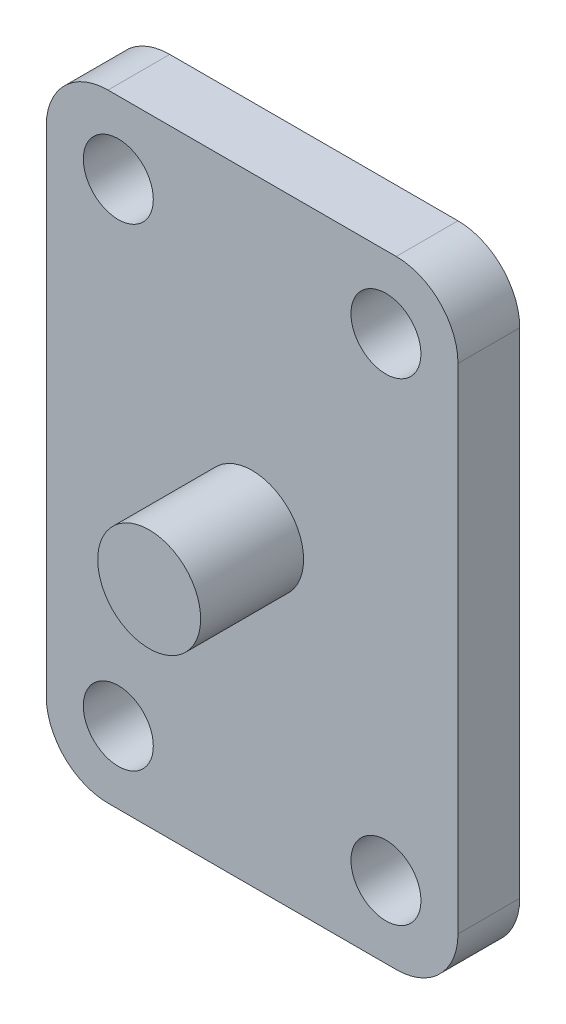
ISO-10303-21;
HEADER;
FILE_DESCRIPTION(('STEP AP214'),'2;1');
FILE_NAME('part.step','',(''),(''),'','','');
FILE_SCHEMA(('AUTOMOTIVE_DESIGN { 1 0 10303 214 1 1 1 1 }'));
ENDSEC;
DATA;
#1=APPLICATION_CONTEXT('core data for automotive mechanical design processes');
#2=APPLICATION_PROTOCOL_DEFINITION('international standard','automotive_design',2000,#1);
#3=PRODUCT_CONTEXT('',#1,'mechanical');
#4=PRODUCT('Part','Part','',(#3));
#5=PRODUCT_RELATED_PRODUCT_CATEGORY('part','',(#4));
#6=PRODUCT_DEFINITION_FORMATION('','',#4);
#7=PRODUCT_DEFINITION_CONTEXT('part definition',#1,'design');
#8=PRODUCT_DEFINITION('design','',#6,#7);
#9=PRODUCT_DEFINITION_SHAPE('','',#8);
#10=(LENGTH_UNIT() NAMED_UNIT(*) SI_UNIT(.MILLI.,.METRE.));
#11=(NAMED_UNIT(*) PLANE_ANGLE_UNIT() SI_UNIT($,.RADIAN.));
#12=(NAMED_UNIT(*) SI_UNIT($,.STERADIAN.) SOLID_ANGLE_UNIT());
#13=UNCERTAINTY_MEASURE_WITH_UNIT(LENGTH_MEASURE(1.E-05),#10,'distance_accuracy_value','');
#14=(GEOMETRIC_REPRESENTATION_CONTEXT(3) GLOBAL_UNCERTAINTY_ASSIGNED_CONTEXT((#13)) GLOBAL_UNIT_ASSIGNED_CONTEXT((#10,
#11,#12)) REPRESENTATION_CONTEXT('',''));
#15=CARTESIAN_POINT('',(0.,0.,0.));
#16=DIRECTION('',(0.,0.,1.));
#17=DIRECTION('',(1.,0.,0.));
#18=AXIS2_PLACEMENT_3D('',#15,#16,#17);
#19=CARTESIAN_POINT('',(0.,0.,3.));
#20=DIRECTION('',(0.,0.,-1.));
#21=DIRECTION('',(-1.,0.,0.));
#22=AXIS2_PLACEMENT_3D('',#19,#20,#21);
#23=PLANE('',#22);
#24=CARTESIAN_POINT('',(-6.5,-11.5,3.));
#25=DIRECTION('',(0.,0.,1.));
#26=DIRECTION('',(1.,0.,0.));
#27=AXIS2_PLACEMENT_3D('',#24,#25,#26);
#28=CIRCLE('',#27,1.7);
#29=CARTESIAN_POINT('',(-4.8,-11.5,3.));
#30=VERTEX_POINT('',#29);
#31=EDGE_CURVE('E171',#30,#30,#28,.T.);
#32=ORIENTED_EDGE('',*,*,#31,.F.);
#33=EDGE_LOOP('',(#32));
#34=FACE_BOUND('',#33,.T.);
#35=DIRECTION('',(0.,-1.,0.));
#36=VECTOR('',#35,1.);
#37=CARTESIAN_POINT('',(-10.,-15.,3.));
#38=LINE('',#37,#36);
#39=CARTESIAN_POINT('',(-10.,12.,3.));
#40=VERTEX_POINT('',#39);
#41=CARTESIAN_POINT('',(-10.,-12.,3.));
#42=VERTEX_POINT('',#41);
#43=EDGE_CURVE('E175',#40,#42,#38,.T.);
#44=ORIENTED_EDGE('',*,*,#43,.T.);
#45=CARTESIAN_POINT('',(-7.,-12.,3.));
#46=DIRECTION('',(0.,0.,-1.));
#47=DIRECTION('',(-1.,0.,0.));
#48=AXIS2_PLACEMENT_3D('',#45,#46,#47);
#49=CIRCLE('',#48,3.);
#50=CARTESIAN_POINT('',(-7.,-15.,3.));
#51=VERTEX_POINT('',#50);
#52=EDGE_CURVE('E151',#42,#51,#49,.F.);
#53=ORIENTED_EDGE('',*,*,#52,.T.);
#54=DIRECTION('',(1.,0.,0.));
#55=VECTOR('',#54,1.);
#56=CARTESIAN_POINT('',(-10.,-15.,3.));
#57=LINE('',#56,#55);
#58=CARTESIAN_POINT('',(7.,-15.,3.));
#59=VERTEX_POINT('',#58);
#60=EDGE_CURVE('E122',#51,#59,#57,.T.);
#61=ORIENTED_EDGE('',*,*,#60,.T.);
#62=CARTESIAN_POINT('',(7.,-12.,3.));
#63=DIRECTION('',(0.,0.,-1.));
#64=DIRECTION('',(-1.,0.,0.));
#65=AXIS2_PLACEMENT_3D('',#62,#63,#64);
#66=CIRCLE('',#65,3.);
#67=CARTESIAN_POINT('',(10.,-12.,3.));
#68=VERTEX_POINT('',#67);
#69=EDGE_CURVE('E149',#59,#68,#66,.F.);
#70=ORIENTED_EDGE('',*,*,#69,.T.);
#71=DIRECTION('',(0.,1.,0.));
#72=VECTOR('',#71,1.);
#73=CARTESIAN_POINT('',(10.,-15.,3.));
#74=LINE('',#73,#72);
#75=CARTESIAN_POINT('',(10.,12.,3.));
#76=VERTEX_POINT('',#75);
#77=EDGE_CURVE('E129',#68,#76,#74,.T.);
#78=ORIENTED_EDGE('',*,*,#77,.T.);
#79=CARTESIAN_POINT('',(7.,12.,3.));
#80=DIRECTION('',(0.,0.,-1.));
#81=DIRECTION('',(-1.,0.,0.));
#82=AXIS2_PLACEMENT_3D('',#79,#80,#81);
#83=CIRCLE('',#82,3.);
#84=CARTESIAN_POINT('',(7.,15.,3.));
#85=VERTEX_POINT('',#84);
#86=EDGE_CURVE('E57',#76,#85,#83,.F.);
#87=ORIENTED_EDGE('',*,*,#86,.T.);
#88=DIRECTION('',(-1.,0.,0.));
#89=VECTOR('',#88,1.);
#90=CARTESIAN_POINT('',(-10.,15.,3.));
#91=LINE('',#90,#89);
#92=CARTESIAN_POINT('',(-7.,15.,3.));
#93=VERTEX_POINT('',#92);
#94=EDGE_CURVE('E132',#85,#93,#91,.T.);
#95=ORIENTED_EDGE('',*,*,#94,.T.);
#96=CARTESIAN_POINT('',(-7.,12.,3.));
#97=DIRECTION('',(0.,0.,-1.));
#98=DIRECTION('',(-1.,0.,0.));
#99=AXIS2_PLACEMENT_3D('',#96,#97,#98);
#100=CIRCLE('',#99,3.);
#101=EDGE_CURVE('E146',#93,#40,#100,.F.);
#102=ORIENTED_EDGE('',*,*,#101,.T.);
#103=EDGE_LOOP('',(#44,#53,#61,#70,#78,#87,#95,#102));
#104=FACE_BOUND('',#103,.T.);
#105=CARTESIAN_POINT('',(6.5,-11.5,3.));
#106=DIRECTION('',(0.,0.,1.));
#107=DIRECTION('',(1.,0.,0.));
#108=AXIS2_PLACEMENT_3D('',#105,#106,#107);
#109=CIRCLE('',#108,1.7);
#110=CARTESIAN_POINT('',(8.2,-11.5,3.));
#111=VERTEX_POINT('',#110);
#112=EDGE_CURVE('E184',#111,#111,#109,.T.);
#113=ORIENTED_EDGE('',*,*,#112,.F.);
#114=EDGE_LOOP('',(#113));
#115=FACE_BOUND('',#114,.T.);
#116=CARTESIAN_POINT('',(6.5,11.5,3.));
#117=DIRECTION('',(0.,0.,1.));
#118=DIRECTION('',(1.,0.,0.));
#119=AXIS2_PLACEMENT_3D('',#116,#117,#118);
#120=CIRCLE('',#119,1.7);
#121=CARTESIAN_POINT('',(8.2,11.5,3.));
#122=VERTEX_POINT('',#121);
#123=EDGE_CURVE('E190',#122,#122,#120,.T.);
#124=ORIENTED_EDGE('',*,*,#123,.F.);
#125=EDGE_LOOP('',(#124));
#126=FACE_BOUND('',#125,.T.);
#127=CARTESIAN_POINT('',(-6.5,11.5,3.));
#128=DIRECTION('',(0.,0.,1.));
#129=DIRECTION('',(1.,0.,0.));
#130=AXIS2_PLACEMENT_3D('',#127,#128,#129);
#131=CIRCLE('',#130,1.7);
#132=CARTESIAN_POINT('',(-4.8,11.5,3.));
#133=VERTEX_POINT('',#132);
#134=EDGE_CURVE('E196',#133,#133,#131,.T.);
#135=ORIENTED_EDGE('',*,*,#134,.F.);
#136=EDGE_LOOP('',(#135));
#137=FACE_BOUND('',#136,.T.);
#138=CARTESIAN_POINT('',(0.,0.,3.));
#139=DIRECTION('',(0.,0.,1.));
#140=DIRECTION('',(1.,0.,0.));
#141=AXIS2_PLACEMENT_3D('',#138,#139,#140);
#142=CIRCLE('',#141,2.5);
#143=CARTESIAN_POINT('',(2.5,0.,3.));
#144=VERTEX_POINT('',#143);
#145=EDGE_CURVE('E199',#144,#144,#142,.T.);
#146=ORIENTED_EDGE('',*,*,#145,.F.);
#147=EDGE_LOOP('',(#146));
#148=FACE_BOUND('',#147,.T.);
#149=ADVANCED_FACE('F35',(#34,#104,#115,#126,#137,#148),#23,.F.);
#150=CARTESIAN_POINT('',(0.,0.,0.));
#151=DIRECTION('',(0.,0.,-1.));
#152=DIRECTION('',(-1.,0.,0.));
#153=AXIS2_PLACEMENT_3D('',#150,#151,#152);
#154=PLANE('',#153);
#155=CARTESIAN_POINT('',(-6.5,11.5,0.));
#156=DIRECTION('',(0.,0.,1.));
#157=DIRECTION('',(1.,0.,0.));
#158=AXIS2_PLACEMENT_3D('',#155,#156,#157);
#159=CIRCLE('',#158,1.7);
#160=CARTESIAN_POINT('',(-4.8,11.5,0.));
#161=VERTEX_POINT('',#160);
#162=EDGE_CURVE('E193',#161,#161,#159,.T.);
#163=ORIENTED_EDGE('',*,*,#162,.T.);
#164=EDGE_LOOP('',(#163));
#165=FACE_BOUND('',#164,.T.);
#166=CARTESIAN_POINT('',(6.5,11.5,0.));
#167=DIRECTION('',(0.,0.,1.));
#168=DIRECTION('',(1.,0.,0.));
#169=AXIS2_PLACEMENT_3D('',#166,#167,#168);
#170=CIRCLE('',#169,1.7);
#171=CARTESIAN_POINT('',(8.2,11.5,0.));
#172=VERTEX_POINT('',#171);
#173=EDGE_CURVE('E187',#172,#172,#170,.T.);
#174=ORIENTED_EDGE('',*,*,#173,.T.);
#175=EDGE_LOOP('',(#174));
#176=FACE_BOUND('',#175,.T.);
#177=CARTESIAN_POINT('',(6.5,-11.5,0.));
#178=DIRECTION('',(0.,0.,1.));
#179=DIRECTION('',(1.,0.,0.));
#180=AXIS2_PLACEMENT_3D('',#177,#178,#179);
#181=CIRCLE('',#180,1.7);
#182=CARTESIAN_POINT('',(8.2,-11.5,0.));
#183=VERTEX_POINT('',#182);
#184=EDGE_CURVE('E181',#183,#183,#181,.T.);
#185=ORIENTED_EDGE('',*,*,#184,.T.);
#186=EDGE_LOOP('',(#185));
#187=FACE_BOUND('',#186,.T.);
#188=DIRECTION('',(1.,0.,0.));
#189=VECTOR('',#188,1.);
#190=CARTESIAN_POINT('',(-10.,-15.,0.));
#191=LINE('',#190,#189);
#192=CARTESIAN_POINT('',(-7.,-15.,0.));
#193=VERTEX_POINT('',#192);
#194=CARTESIAN_POINT('',(7.,-15.,0.));
#195=VERTEX_POINT('',#194);
#196=EDGE_CURVE('E119',#193,#195,#191,.T.);
#197=ORIENTED_EDGE('',*,*,#196,.F.);
#198=CARTESIAN_POINT('',(-7.,-12.,0.));
#199=DIRECTION('',(0.,0.,-1.));
#200=DIRECTION('',(-1.,0.,0.));
#201=AXIS2_PLACEMENT_3D('',#198,#199,#200);
#202=CIRCLE('',#201,3.);
#203=CARTESIAN_POINT('',(-10.,-12.,0.));
#204=VERTEX_POINT('',#203);
#205=EDGE_CURVE('E102',#193,#204,#202,.T.);
#206=ORIENTED_EDGE('',*,*,#205,.T.);
#207=DIRECTION('',(0.,-1.,0.));
#208=VECTOR('',#207,1.);
#209=CARTESIAN_POINT('',(-10.,-15.,0.));
#210=LINE('',#209,#208);
#211=CARTESIAN_POINT('',(-10.,12.,0.));
#212=VERTEX_POINT('',#211);
#213=EDGE_CURVE('E130',#212,#204,#210,.T.);
#214=ORIENTED_EDGE('',*,*,#213,.F.);
#215=CARTESIAN_POINT('',(-7.,12.,0.));
#216=DIRECTION('',(0.,0.,-1.));
#217=DIRECTION('',(-1.,0.,0.));
#218=AXIS2_PLACEMENT_3D('',#215,#216,#217);
#219=CIRCLE('',#218,3.);
#220=CARTESIAN_POINT('',(-7.,15.,0.));
#221=VERTEX_POINT('',#220);
#222=EDGE_CURVE('E123',#212,#221,#219,.T.);
#223=ORIENTED_EDGE('',*,*,#222,.T.);
#224=DIRECTION('',(-1.,0.,0.));
#225=VECTOR('',#224,1.);
#226=CARTESIAN_POINT('',(-10.,15.,0.));
#227=LINE('',#226,#225);
#228=CARTESIAN_POINT('',(7.,15.,0.));
#229=VERTEX_POINT('',#228);
#230=EDGE_CURVE('E134',#229,#221,#227,.T.);
#231=ORIENTED_EDGE('',*,*,#230,.F.);
#232=CARTESIAN_POINT('',(7.,12.,0.));
#233=DIRECTION('',(0.,0.,-1.));
#234=DIRECTION('',(-1.,0.,0.));
#235=AXIS2_PLACEMENT_3D('',#232,#233,#234);
#236=CIRCLE('',#235,3.);
#237=CARTESIAN_POINT('',(10.,12.,0.));
#238=VERTEX_POINT('',#237);
#239=EDGE_CURVE('E140',#229,#238,#236,.T.);
#240=ORIENTED_EDGE('',*,*,#239,.T.);
#241=DIRECTION('',(0.,1.,0.));
#242=VECTOR('',#241,1.);
#243=CARTESIAN_POINT('',(10.,-15.,0.));
#244=LINE('',#243,#242);
#245=CARTESIAN_POINT('',(10.,-12.,0.));
#246=VERTEX_POINT('',#245);
#247=EDGE_CURVE('E163',#246,#238,#244,.T.);
#248=ORIENTED_EDGE('',*,*,#247,.F.);
#249=CARTESIAN_POINT('',(7.,-12.,0.));
#250=DIRECTION('',(0.,0.,-1.));
#251=DIRECTION('',(-1.,0.,0.));
#252=AXIS2_PLACEMENT_3D('',#249,#250,#251);
#253=CIRCLE('',#252,3.);
#254=EDGE_CURVE('E113',#246,#195,#253,.T.);
#255=ORIENTED_EDGE('',*,*,#254,.T.);
#256=EDGE_LOOP('',(#197,#206,#214,#223,#231,#240,#248,#255));
#257=FACE_BOUND('',#256,.T.);
#258=CARTESIAN_POINT('',(-6.5,-11.5,0.));
#259=DIRECTION('',(0.,0.,1.));
#260=DIRECTION('',(1.,0.,0.));
#261=AXIS2_PLACEMENT_3D('',#258,#259,#260);
#262=CIRCLE('',#261,1.7);
#263=CARTESIAN_POINT('',(-4.8,-11.5,0.));
#264=VERTEX_POINT('',#263);
#265=EDGE_CURVE('E168',#264,#264,#262,.T.);
#266=ORIENTED_EDGE('',*,*,#265,.T.);
#267=EDGE_LOOP('',(#266));
#268=FACE_BOUND('',#267,.T.);
#269=CARTESIAN_POINT('',(0.,0.,0.));
#270=DIRECTION('',(0.,0.,-1.));
#271=DIRECTION('',(-1.,0.,0.));
#272=AXIS2_PLACEMENT_3D('',#269,#270,#271);
#273=CIRCLE('',#272,2.75);
#274=CARTESIAN_POINT('',(-2.75,0.,0.));
#275=VERTEX_POINT('',#274);
#276=EDGE_CURVE('E205',#275,#275,#273,.T.);
#277=ORIENTED_EDGE('',*,*,#276,.F.);
#278=EDGE_LOOP('',(#277));
#279=FACE_BOUND('',#278,.T.);
#280=ADVANCED_FACE('F126',(#165,#176,#187,#257,#268,#279),#154,.T.);
#281=CARTESIAN_POINT('',(10.,-15.,3.));
#282=DIRECTION('',(-1.,0.,0.));
#283=DIRECTION('',(0.,0.,1.));
#284=AXIS2_PLACEMENT_3D('',#281,#282,#283);
#285=PLANE('',#284);
#286=ORIENTED_EDGE('',*,*,#77,.F.);
#287=DIRECTION('',(0.,0.,-1.));
#288=VECTOR('',#287,1.);
#289=CARTESIAN_POINT('',(10.,-12.,3.));
#290=LINE('',#289,#288);
#291=EDGE_CURVE('E155',#68,#246,#290,.T.);
#292=ORIENTED_EDGE('',*,*,#291,.T.);
#293=ORIENTED_EDGE('',*,*,#247,.T.);
#294=DIRECTION('',(0.,0.,-1.));
#295=VECTOR('',#294,1.);
#296=CARTESIAN_POINT('',(10.,12.,3.));
#297=LINE('',#296,#295);
#298=EDGE_CURVE('E153',#238,#76,#297,.F.);
#299=ORIENTED_EDGE('',*,*,#298,.T.);
#300=EDGE_LOOP('',(#286,#292,#293,#299));
#301=FACE_BOUND('',#300,.T.);
#302=ADVANCED_FACE('F162',(#301),#285,.F.);
#303=CARTESIAN_POINT('',(-10.,15.,3.));
#304=DIRECTION('',(0.,-1.,0.));
#305=DIRECTION('',(0.,0.,-1.));
#306=AXIS2_PLACEMENT_3D('',#303,#304,#305);
#307=PLANE('',#306);
#308=ORIENTED_EDGE('',*,*,#94,.F.);
#309=DIRECTION('',(0.,0.,-1.));
#310=VECTOR('',#309,1.);
#311=CARTESIAN_POINT('',(7.,15.,3.));
#312=LINE('',#311,#310);
#313=EDGE_CURVE('E12',#85,#229,#312,.T.);
#314=ORIENTED_EDGE('',*,*,#313,.T.);
#315=ORIENTED_EDGE('',*,*,#230,.T.);
#316=DIRECTION('',(0.,0.,-1.));
#317=VECTOR('',#316,1.);
#318=CARTESIAN_POINT('',(-7.,15.,3.));
#319=LINE('',#318,#317);
#320=EDGE_CURVE('E44',#221,#93,#319,.F.);
#321=ORIENTED_EDGE('',*,*,#320,.T.);
#322=EDGE_LOOP('',(#308,#314,#315,#321));
#323=FACE_BOUND('',#322,.T.);
#324=ADVANCED_FACE('F218',(#323),#307,.F.);
#325=CARTESIAN_POINT('',(-10.,-15.,3.));
#326=DIRECTION('',(1.,0.,0.));
#327=DIRECTION('',(0.,0.,-1.));
#328=AXIS2_PLACEMENT_3D('',#325,#326,#327);
#329=PLANE('',#328);
#330=ORIENTED_EDGE('',*,*,#213,.T.);
#331=DIRECTION('',(0.,0.,-1.));
#332=VECTOR('',#331,1.);
#333=CARTESIAN_POINT('',(-10.,-12.,3.));
#334=LINE('',#333,#332);
#335=EDGE_CURVE('E107',#204,#42,#334,.F.);
#336=ORIENTED_EDGE('',*,*,#335,.T.);
#337=ORIENTED_EDGE('',*,*,#43,.F.);
#338=DIRECTION('',(0.,0.,-1.));
#339=VECTOR('',#338,1.);
#340=CARTESIAN_POINT('',(-10.,12.,3.));
#341=LINE('',#340,#339);
#342=EDGE_CURVE('E112',#40,#212,#341,.T.);
#343=ORIENTED_EDGE('',*,*,#342,.T.);
#344=EDGE_LOOP('',(#330,#336,#337,#343));
#345=FACE_BOUND('',#344,.T.);
#346=ADVANCED_FACE('F228',(#345),#329,.F.);
#347=CARTESIAN_POINT('',(-10.,-15.,3.));
#348=DIRECTION('',(0.,1.,0.));
#349=DIRECTION('',(0.,0.,1.));
#350=AXIS2_PLACEMENT_3D('',#347,#348,#349);
#351=PLANE('',#350);
#352=ORIENTED_EDGE('',*,*,#60,.F.);
#353=DIRECTION('',(0.,0.,-1.));
#354=VECTOR('',#353,1.);
#355=CARTESIAN_POINT('',(-7.,-15.,3.));
#356=LINE('',#355,#354);
#357=EDGE_CURVE('E106',#51,#193,#356,.T.);
#358=ORIENTED_EDGE('',*,*,#357,.T.);
#359=ORIENTED_EDGE('',*,*,#196,.T.);
#360=DIRECTION('',(0.,0.,-1.));
#361=VECTOR('',#360,1.);
#362=CARTESIAN_POINT('',(7.,-15.,3.));
#363=LINE('',#362,#361);
#364=EDGE_CURVE('E124',#195,#59,#363,.F.);
#365=ORIENTED_EDGE('',*,*,#364,.T.);
#366=EDGE_LOOP('',(#352,#358,#359,#365));
#367=FACE_BOUND('',#366,.T.);
#368=ADVANCED_FACE('F118',(#367),#351,.F.);
#369=CARTESIAN_POINT('',(-6.5,-11.5,3.));
#370=DIRECTION('',(0.,0.,1.));
#371=DIRECTION('',(1.,0.,0.));
#372=AXIS2_PLACEMENT_3D('',#369,#370,#371);
#373=CYLINDRICAL_SURFACE('',#372,1.7);
#374=ORIENTED_EDGE('',*,*,#265,.F.);
#375=EDGE_LOOP('',(#374));
#376=FACE_BOUND('',#375,.T.);
#377=ORIENTED_EDGE('',*,*,#31,.T.);
#378=EDGE_LOOP('',(#377));
#379=FACE_BOUND('',#378,.T.);
#380=ADVANCED_FACE('F227',(#376,#379),#373,.F.);
#381=CARTESIAN_POINT('',(6.5,-11.5,3.));
#382=DIRECTION('',(0.,0.,1.));
#383=DIRECTION('',(1.,0.,0.));
#384=AXIS2_PLACEMENT_3D('',#381,#382,#383);
#385=CYLINDRICAL_SURFACE('',#384,1.7);
#386=ORIENTED_EDGE('',*,*,#184,.F.);
#387=EDGE_LOOP('',(#386));
#388=FACE_BOUND('',#387,.T.);
#389=ORIENTED_EDGE('',*,*,#112,.T.);
#390=EDGE_LOOP('',(#389));
#391=FACE_BOUND('',#390,.T.);
#392=ADVANCED_FACE('F282',(#388,#391),#385,.F.);
#393=CARTESIAN_POINT('',(6.5,11.5,3.));
#394=DIRECTION('',(0.,0.,1.));
#395=DIRECTION('',(1.,0.,0.));
#396=AXIS2_PLACEMENT_3D('',#393,#394,#395);
#397=CYLINDRICAL_SURFACE('',#396,1.7);
#398=ORIENTED_EDGE('',*,*,#173,.F.);
#399=EDGE_LOOP('',(#398));
#400=FACE_BOUND('',#399,.T.);
#401=ORIENTED_EDGE('',*,*,#123,.T.);
#402=EDGE_LOOP('',(#401));
#403=FACE_BOUND('',#402,.T.);
#404=ADVANCED_FACE('F278',(#400,#403),#397,.F.);
#405=CARTESIAN_POINT('',(-6.5,11.5,3.));
#406=DIRECTION('',(0.,0.,1.));
#407=DIRECTION('',(1.,0.,0.));
#408=AXIS2_PLACEMENT_3D('',#405,#406,#407);
#409=CYLINDRICAL_SURFACE('',#408,1.7);
#410=ORIENTED_EDGE('',*,*,#162,.F.);
#411=EDGE_LOOP('',(#410));
#412=FACE_BOUND('',#411,.T.);
#413=ORIENTED_EDGE('',*,*,#134,.T.);
#414=EDGE_LOOP('',(#413));
#415=FACE_BOUND('',#414,.T.);
#416=ADVANCED_FACE('F237',(#412,#415),#409,.F.);
#417=CARTESIAN_POINT('',(-7.,-12.,3.));
#418=DIRECTION('',(0.,0.,-1.));
#419=DIRECTION('',(-1.,0.,0.));
#420=AXIS2_PLACEMENT_3D('',#417,#418,#419);
#421=CYLINDRICAL_SURFACE('',#420,3.);
#422=ORIENTED_EDGE('',*,*,#52,.F.);
#423=ORIENTED_EDGE('',*,*,#335,.F.);
#424=ORIENTED_EDGE('',*,*,#205,.F.);
#425=ORIENTED_EDGE('',*,*,#357,.F.);
#426=EDGE_LOOP('',(#422,#423,#424,#425));
#427=FACE_BOUND('',#426,.T.);
#428=ADVANCED_FACE('F105',(#427),#421,.T.);
#429=CARTESIAN_POINT('',(7.,-12.,3.));
#430=DIRECTION('',(0.,0.,-1.));
#431=DIRECTION('',(-1.,0.,0.));
#432=AXIS2_PLACEMENT_3D('',#429,#430,#431);
#433=CYLINDRICAL_SURFACE('',#432,3.);
#434=ORIENTED_EDGE('',*,*,#69,.F.);
#435=ORIENTED_EDGE('',*,*,#364,.F.);
#436=ORIENTED_EDGE('',*,*,#254,.F.);
#437=ORIENTED_EDGE('',*,*,#291,.F.);
#438=EDGE_LOOP('',(#434,#435,#436,#437));
#439=FACE_BOUND('',#438,.T.);
#440=ADVANCED_FACE('F236',(#439),#433,.T.);
#441=CARTESIAN_POINT('',(7.,12.,3.));
#442=DIRECTION('',(0.,0.,-1.));
#443=DIRECTION('',(-1.,0.,0.));
#444=AXIS2_PLACEMENT_3D('',#441,#442,#443);
#445=CYLINDRICAL_SURFACE('',#444,3.);
#446=ORIENTED_EDGE('',*,*,#86,.F.);
#447=ORIENTED_EDGE('',*,*,#298,.F.);
#448=ORIENTED_EDGE('',*,*,#239,.F.);
#449=ORIENTED_EDGE('',*,*,#313,.F.);
#450=EDGE_LOOP('',(#446,#447,#448,#449));
#451=FACE_BOUND('',#450,.T.);
#452=ADVANCED_FACE('F239',(#451),#445,.T.);
#453=CARTESIAN_POINT('',(-7.,12.,3.));
#454=DIRECTION('',(0.,0.,-1.));
#455=DIRECTION('',(-1.,0.,0.));
#456=AXIS2_PLACEMENT_3D('',#453,#454,#455);
#457=CYLINDRICAL_SURFACE('',#456,3.);
#458=ORIENTED_EDGE('',*,*,#101,.F.);
#459=ORIENTED_EDGE('',*,*,#320,.F.);
#460=ORIENTED_EDGE('',*,*,#222,.F.);
#461=ORIENTED_EDGE('',*,*,#342,.F.);
#462=EDGE_LOOP('',(#458,#459,#460,#461));
#463=FACE_BOUND('',#462,.T.);
#464=ADVANCED_FACE('F37',(#463),#457,.T.);
#465=CARTESIAN_POINT('',(0.,0.,14.));
#466=DIRECTION('',(0.,0.,-1.));
#467=DIRECTION('',(-1.,0.,0.));
#468=AXIS2_PLACEMENT_3D('',#465,#466,#467);
#469=CYLINDRICAL_SURFACE('',#468,2.5);
#470=CARTESIAN_POINT('',(0.,0.,8.));
#471=DIRECTION('',(0.,0.,-1.));
#472=DIRECTION('',(0.,1.,0.));
#473=AXIS2_PLACEMENT_3D('',#470,#471,#472);
#474=CIRCLE('',#473,2.5);
#475=CARTESIAN_POINT('',(0.,2.5,8.));
#476=VERTEX_POINT('',#475);
#477=EDGE_CURVE('E39',#476,#476,#474,.T.);
#478=ORIENTED_EDGE('',*,*,#477,.T.);
#479=EDGE_LOOP('',(#478));
#480=FACE_BOUND('',#479,.T.);
#481=ORIENTED_EDGE('',*,*,#145,.T.);
#482=EDGE_LOOP('',(#481));
#483=FACE_BOUND('',#482,.T.);
#484=ADVANCED_FACE('F245',(#480,#483),#469,.T.);
#485=CARTESIAN_POINT('',(-10.,10.441731409545,8.));
#486=DIRECTION('',(0.,0.,-1.));
#487=DIRECTION('',(0.,1.,0.));
#488=AXIS2_PLACEMENT_3D('',#485,#486,#487);
#489=PLANE('',#488);
#490=ORIENTED_EDGE('',*,*,#477,.F.);
#491=EDGE_LOOP('',(#490));
#492=FACE_BOUND('',#491,.T.);
#493=ADVANCED_FACE('F261',(#492),#489,.F.);
#494=CARTESIAN_POINT('',(0.,0.,10.116652224137));
#495=DIRECTION('',(0.,0.,-1.));
#496=DIRECTION('',(-1.,0.,0.));
#497=AXIS2_PLACEMENT_3D('',#494,#495,#496);
#498=CYLINDRICAL_SURFACE('',#497,2.75);
#499=CARTESIAN_POINT('',(0.,0.,0.5));
#500=DIRECTION('',(0.,0.,-1.));
#501=DIRECTION('',(-1.,0.,0.));
#502=AXIS2_PLACEMENT_3D('',#499,#500,#501);
#503=CIRCLE('',#502,2.75);
#504=CARTESIAN_POINT('',(-2.75,0.,0.5));
#505=VERTEX_POINT('',#504);
#506=EDGE_CURVE('E202',#505,#505,#503,.F.);
#507=ORIENTED_EDGE('',*,*,#506,.T.);
#508=EDGE_LOOP('',(#507));
#509=FACE_BOUND('',#508,.T.);
#510=ORIENTED_EDGE('',*,*,#276,.T.);
#511=EDGE_LOOP('',(#510));
#512=FACE_BOUND('',#511,.T.);
#513=ADVANCED_FACE('F209',(#509,#512),#498,.F.);
#514=CARTESIAN_POINT('',(0.,0.,0.5));
#515=DIRECTION('',(0.,0.,-1.));
#516=DIRECTION('',(-1.,0.,0.));
#517=AXIS2_PLACEMENT_3D('',#514,#515,#516);
#518=PLANE('',#517);
#519=ORIENTED_EDGE('',*,*,#506,.F.);
#520=EDGE_LOOP('',(#519));
#521=FACE_BOUND('',#520,.T.);
#522=ADVANCED_FACE('F272',(#521),#518,.T.);
#523=CLOSED_SHELL('',(#149,#280,#302,#324,#346,#368,#380,#392,#404,#416,#428,#440,#452,#464,
#484,#493,#513,#522));
#524=MANIFOLD_SOLID_BREP('B2',#523);
#525=ADVANCED_BREP_SHAPE_REPRESENTATION('',(#18,#524),#14);
#526=SHAPE_DEFINITION_REPRESENTATION(#9,#525);
ENDSEC;
END-ISO-10303-21;
